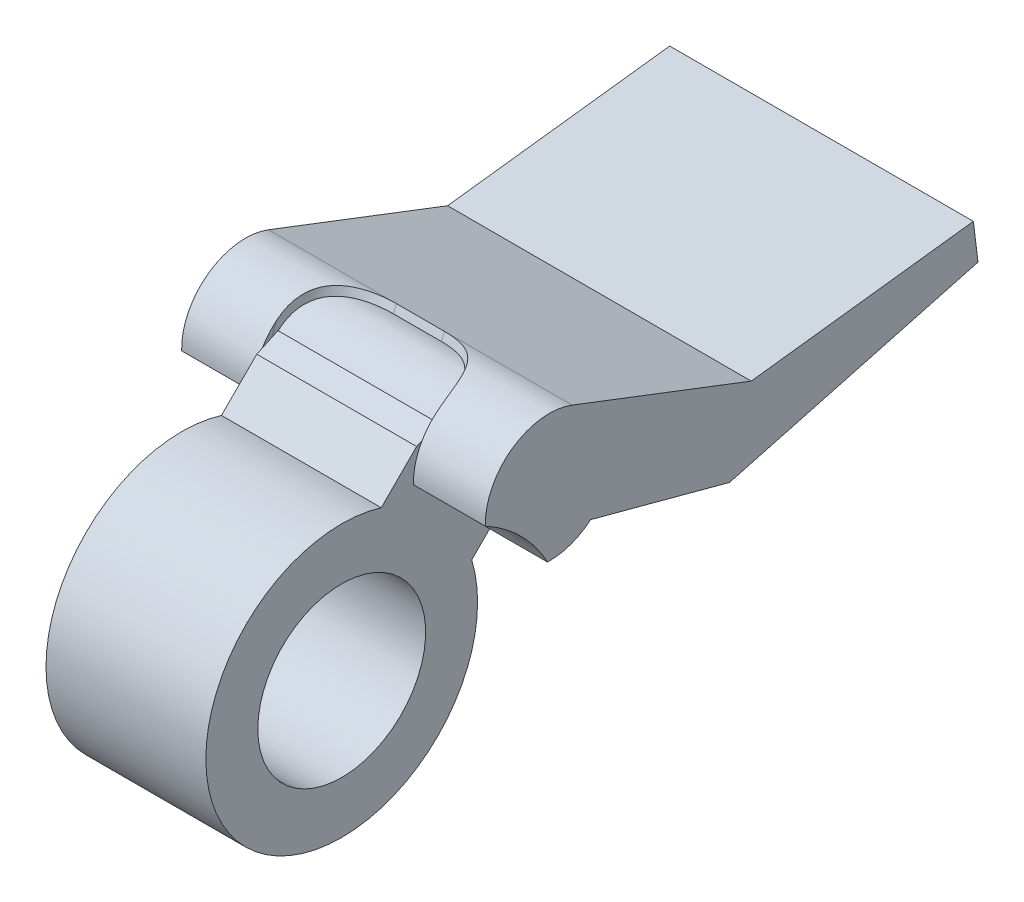
ISO-10303-21;
HEADER;
FILE_DESCRIPTION(('STEP AP214'),'2;1');
FILE_NAME('part.step','',(''),(''),'','','');
FILE_SCHEMA(('AUTOMOTIVE_DESIGN { 1 0 10303 214 1 1 1 1 }'));
ENDSEC;
DATA;
#1=APPLICATION_CONTEXT('core data for automotive mechanical design processes');
#2=APPLICATION_PROTOCOL_DEFINITION('international standard','automotive_design',2000,#1);
#3=PRODUCT_CONTEXT('',#1,'mechanical');
#4=PRODUCT('Part','Part','',(#3));
#5=PRODUCT_RELATED_PRODUCT_CATEGORY('part','',(#4));
#6=PRODUCT_DEFINITION_FORMATION('','',#4);
#7=PRODUCT_DEFINITION_CONTEXT('part definition',#1,'design');
#8=PRODUCT_DEFINITION('design','',#6,#7);
#9=PRODUCT_DEFINITION_SHAPE('','',#8);
#10=(LENGTH_UNIT() NAMED_UNIT(*) SI_UNIT(.MILLI.,.METRE.));
#11=(NAMED_UNIT(*) PLANE_ANGLE_UNIT() SI_UNIT($,.RADIAN.));
#12=(NAMED_UNIT(*) SI_UNIT($,.STERADIAN.) SOLID_ANGLE_UNIT());
#13=UNCERTAINTY_MEASURE_WITH_UNIT(LENGTH_MEASURE(1.E-05),#10,'distance_accuracy_value','');
#14=(GEOMETRIC_REPRESENTATION_CONTEXT(3) GLOBAL_UNCERTAINTY_ASSIGNED_CONTEXT((#13)) GLOBAL_UNIT_ASSIGNED_CONTEXT((#10,
#11,#12)) REPRESENTATION_CONTEXT('',''));
#15=CARTESIAN_POINT('',(0.,0.,0.));
#16=DIRECTION('',(0.,0.,1.));
#17=DIRECTION('',(1.,0.,0.));
#18=AXIS2_PLACEMENT_3D('',#15,#16,#17);
#19=CARTESIAN_POINT('',(10.,10.3423285417581,-4.68547429226573));
#20=DIRECTION('',(0.,-0.90630778703665,-0.4226182617407));
#21=DIRECTION('',(0.,0.4226182617407,-0.90630778703665));
#22=AXIS2_PLACEMENT_3D('',#19,#20,#21);
#23=PLANE('',#22);
#24=CARTESIAN_POINT('',(6.5,10.7760639855093,-5.61562295306029));
#25=DIRECTION('',(0.,-0.90630778703665,-0.4226182617407));
#26=DIRECTION('',(0.,0.4226182617407,-0.90630778703665));
#27=AXIS2_PLACEMENT_3D('',#24,#25,#26);
#28=ELLIPSE('',#27,5.03844788869005,3.5);
#29=CARTESIAN_POINT('',(9.98689528783067,10.9601551083915,-6.01040764008563));
#30=VERTEX_POINT('',#29);
#31=CARTESIAN_POINT('',(10.,10.7760639855093,-5.61562295306029));
#32=VERTEX_POINT('',#31);
#33=EDGE_CURVE('E181',#30,#32,#28,.T.);
#34=ORIENTED_EDGE('',*,*,#33,.F.);
#35=DIRECTION('',(-1.,0.,0.));
#36=VECTOR('',#35,1.);
#37=CARTESIAN_POINT('',(14.5265652051005,10.9601551083915,-6.01040764008563));
#38=LINE('',#37,#36);
#39=CARTESIAN_POINT('',(0.0131047121693319,10.9601551083915,-6.01040764008563));
#40=VERTEX_POINT('',#39);
#41=EDGE_CURVE('E179',#40,#30,#38,.F.);
#42=ORIENTED_EDGE('',*,*,#41,.F.);
#43=CARTESIAN_POINT('',(3.5,10.7760639855093,-5.61562295306029));
#44=DIRECTION('',(0.,-0.90630778703665,-0.4226182617407));
#45=DIRECTION('',(0.,0.4226182617407,-0.90630778703665));
#46=AXIS2_PLACEMENT_3D('',#43,#44,#45);
#47=ELLIPSE('',#46,5.03844788869005,3.5);
#48=CARTESIAN_POINT('',(0.,10.7760639855093,-5.61562295306029));
#49=VERTEX_POINT('',#48);
#50=EDGE_CURVE('E20',#49,#40,#47,.T.);
#51=ORIENTED_EDGE('',*,*,#50,.F.);
#52=DIRECTION('',(0.,0.4226182617407,-0.90630778703665));
#53=VECTOR('',#52,1.);
#54=CARTESIAN_POINT('',(0.,10.3423285417581,-4.68547429226573));
#55=LINE('',#54,#53);
#56=CARTESIAN_POINT('',(0.,10.5039197101017,-5.03200767107168));
#57=VERTEX_POINT('',#56);
#58=EDGE_CURVE('E157',#57,#49,#55,.T.);
#59=ORIENTED_EDGE('',*,*,#58,.F.);
#60=DIRECTION('',(0.,0.4226182617407,-0.90630778703665));
#61=VECTOR('',#60,1.);
#62=CARTESIAN_POINT('',(0.,10.3423285417581,-4.68547429226573));
#63=LINE('',#62,#61);
#64=CARTESIAN_POINT('',(0.,10.3423285417581,-4.68547429226573));
#65=VERTEX_POINT('',#64);
#66=EDGE_CURVE('E166',#65,#57,#63,.T.);
#67=ORIENTED_EDGE('',*,*,#66,.F.);
#68=DIRECTION('',(1.,0.,0.));
#69=VECTOR('',#68,1.);
#70=CARTESIAN_POINT('',(10.,10.3423285417581,-4.68547429226573));
#71=LINE('',#70,#69);
#72=CARTESIAN_POINT('',(10.,10.3423285417581,-4.68547429226573));
#73=VERTEX_POINT('',#72);
#74=EDGE_CURVE('E463',#73,#65,#71,.F.);
#75=ORIENTED_EDGE('',*,*,#74,.F.);
#76=DIRECTION('',(0.,0.4226182617407,-0.90630778703665));
#77=VECTOR('',#76,1.);
#78=CARTESIAN_POINT('',(10.,10.3423285417581,-4.68547429226573));
#79=LINE('',#78,#77);
#80=CARTESIAN_POINT('',(10.,10.5039197101017,-5.03200767107168));
#81=VERTEX_POINT('',#80);
#82=EDGE_CURVE('E471',#81,#73,#79,.F.);
#83=ORIENTED_EDGE('',*,*,#82,.F.);
#84=DIRECTION('',(0.,0.4226182617407,-0.90630778703665));
#85=VECTOR('',#84,1.);
#86=CARTESIAN_POINT('',(10.,10.3423285417581,-4.68547429226573));
#87=LINE('',#86,#85);
#88=EDGE_CURVE('E182',#32,#81,#87,.F.);
#89=ORIENTED_EDGE('',*,*,#88,.F.);
#90=EDGE_LOOP('',(#34,#42,#51,#59,#67,#75,#83,#89));
#91=FACE_BOUND('',#90,.T.);
#92=ADVANCED_FACE('F17',(#91),#23,.F.);
#93=CARTESIAN_POINT('',(14.5265652051005,8.48528137423859,-8.48528137423856));
#94=DIRECTION('',(-1.,0.,0.));
#95=DIRECTION('',(0.,0.,1.));
#96=AXIS2_PLACEMENT_3D('',#93,#94,#95);
#97=CYLINDRICAL_SURFACE('',#96,3.5);
#98=DIRECTION('',(1.,0.,0.));
#99=VECTOR('',#98,1.);
#100=CARTESIAN_POINT('',(14.5265652051005,11.7528128669788,-9.73956919764712));
#101=LINE('',#100,#99);
#102=CARTESIAN_POINT('',(3.5,11.7528128669788,-9.73956919764712));
#103=VERTEX_POINT('',#102);
#104=CARTESIAN_POINT('',(6.5,11.7528128669788,-9.73956919764712));
#105=VERTEX_POINT('',#104);
#106=EDGE_CURVE('E442',#103,#105,#101,.T.);
#107=ORIENTED_EDGE('',*,*,#106,.F.);
#108=CARTESIAN_POINT('',(3.5,11.7528128669788,-9.73956919764712));
#109=CARTESIAN_POINT('',(3.4025676074427,11.752781186248,-9.73956791054752));
#110=CARTESIAN_POINT('',(3.3051366374572,11.7542698399467,-9.73577101631505));
#111=CARTESIAN_POINT('',(3.11095369032644,11.760058994028,-9.7205764045936));
#112=CARTESIAN_POINT('',(3.01420170902847,11.7643594771981,-9.70917873363219));
#113=CARTESIAN_POINT('',(2.82188429503188,11.7755532156788,-9.67874647310753));
#114=CARTESIAN_POINT('',(2.72632122321626,11.7824509750819,-9.65969861304701));
#115=CARTESIAN_POINT('',(2.53722729784305,11.7983909539184,-9.61395101133336));
#116=CARTESIAN_POINT('',(2.44369641799689,11.8074331455933,-9.58725136872769));
#117=CARTESIAN_POINT('',(2.25924841442293,11.8270769458929,-9.52616130618465));
#118=CARTESIAN_POINT('',(2.16833381576069,11.8376800043558,-9.49176372025579));
#119=CARTESIAN_POINT('',(1.9898521164323,11.859695532696,-9.41528804404663));
#120=CARTESIAN_POINT('',(1.90228621198938,11.8711082877328,-9.3732072395915));
#121=CARTESIAN_POINT('',(1.73129902627252,11.8938458808696,-9.2814710731802));
#122=CARTESIAN_POINT('',(1.64787408663297,11.9051707888358,-9.23182256074788));
#123=CARTESIAN_POINT('',(1.48579372439595,11.9267392960008,-9.12507086086172));
#124=CARTESIAN_POINT('',(1.40713759152401,11.9369830563969,-9.06796878756865));
#125=CARTESIAN_POINT('',(1.25822406218825,11.9549369312418,-8.94893030001388));
#126=CARTESIAN_POINT('',(1.18775961389857,11.9627296229293,-8.88726579019605));
#127=CARTESIAN_POINT('',(1.05252700247004,11.9752655578555,-8.75774881690683));
#128=CARTESIAN_POINT('',(0.987755758036894,11.9800104595106,-8.68989974168003));
#129=CARTESIAN_POINT('',(0.864486938755875,11.9854194725079,-8.54867997186559));
#130=CARTESIAN_POINT('',(0.805983197417952,11.9860876317962,-8.47531482770426));
#131=CARTESIAN_POINT('',(0.695629294468147,11.9823767365089,-8.32386261084754));
#132=CARTESIAN_POINT('',(0.64377797277605,11.9779985632696,-8.24577636494385));
#133=CARTESIAN_POINT('',(0.553593276450099,11.9643514641508,-8.09685248391291));
#134=CARTESIAN_POINT('',(0.514380640771426,11.9558300610736,-8.02647654928564));
#135=CARTESIAN_POINT('',(0.441155804331323,11.9339659507001,-7.88379800741679));
#136=CARTESIAN_POINT('',(0.407143223427473,11.9206235960724,-7.81149554146567));
#137=CARTESIAN_POINT('',(0.344224570915974,11.8888118213275,-7.66580881720184));
#138=CARTESIAN_POINT('',(0.315318212463551,11.8703426893597,-7.59242461990705));
#139=CARTESIAN_POINT('',(0.262379666762911,11.8281232747902,-7.44544096644063));
#140=CARTESIAN_POINT('',(0.238347444502004,11.8043730301272,-7.37184151181913));
#141=CARTESIAN_POINT('',(0.175592723579635,11.7281746360687,-7.16048197476904));
#142=CARTESIAN_POINT('',(0.142613980091129,11.6688933627925,-7.02339965149114));
#143=CARTESIAN_POINT('',(0.089624938615377,11.5320063678796,-6.7560972639787));
#144=CARTESIAN_POINT('',(0.0696216633976598,11.4543907540153,-6.62588095083187));
#145=CARTESIAN_POINT('',(0.0435871694539562,11.3080885333855,-6.41330298540576));
#146=CARTESIAN_POINT('',(0.0351677118626656,11.2436508120867,-6.32825805976484));
#147=CARTESIAN_POINT('',(0.0218225509425708,11.1073441587283,-6.16447608509379));
#148=CARTESIAN_POINT('',(0.0168865304938026,11.0354978996574,-6.08572102667538));
#149=CARTESIAN_POINT('',(0.0131047121693309,10.9601551083915,-6.01040764008563));
#150=B_SPLINE_CURVE_WITH_KNOTS('',3,(#108,#109,#110,#111,#112,#113,#114,#115,#116,#117,#118,
#119,#120,#121,#122,#123,#124,#125,#126,#127,#128,#129,#130,#131,#132,#133,#134,#135,#136,#137,
#138,#139,#140,#141,#142,#143,#144,#145,#146,#147,#148,#149),.UNSPECIFIED.,.F.,.F.,(4,2,2,2,2,2,
2,2,2,2,2,2,2,2,2,2,2,2,2,2,4),(0.,0.29220984509211,0.584417901460318,0.87713504472713,
1.16984839912799,1.46283538137322,1.75592606520031,2.04875303113694,2.34153627522083,
2.62301114727313,2.90433272828975,3.18537492933528,3.46636805411258,3.70908135858463,
3.95177691136182,4.19445882624814,4.43713899780042,4.89390982158901,5.35092765963071,
5.67154438835239,5.99120749472194),.UNSPECIFIED.);
#151=EDGE_CURVE('E175',#103,#40,#150,.T.);
#152=ORIENTED_EDGE('',*,*,#151,.T.);
#153=ORIENTED_EDGE('',*,*,#41,.T.);
#154=CARTESIAN_POINT('',(9.98689528783067,10.9601551083915,-6.01040764008563));
#155=CARTESIAN_POINT('',(9.98383068440402,11.0213605694413,-6.07159707492825));
#156=CARTESIAN_POINT('',(9.97999470231724,11.0802700482353,-6.1350618223779));
#157=CARTESIAN_POINT('',(9.97017866934813,11.1931866568324,-6.26611194449141));
#158=CARTESIAN_POINT('',(9.96419749819988,11.2471912066695,-6.33369945682168));
#159=CARTESIAN_POINT('',(9.94945786152549,11.350159422206,-6.47281978255372));
#160=CARTESIAN_POINT('',(9.94068673119811,11.3990987249413,-6.54436933348673));
#161=CARTESIAN_POINT('',(9.91972201686225,11.4913310038454,-6.69053083166246));
#162=CARTESIAN_POINT('',(9.90752901974698,11.5346249464013,-6.76514225188417));
#163=CARTESIAN_POINT('',(9.87899470100175,11.6155059374659,-6.91711731364479));
#164=CARTESIAN_POINT('',(9.8626336009626,11.6530643714767,-6.99449252113921));
#165=CARTESIAN_POINT('',(9.82516013054991,11.722024632355,-7.15081918629097));
#166=CARTESIAN_POINT('',(9.80404828369698,11.753427136878,-7.22977046939572));
#167=CARTESIAN_POINT('',(9.75658913105542,11.8099136475857,-7.38807516177691));
#168=CARTESIAN_POINT('',(9.73025778296333,11.8350163967299,-7.4674266440887));
#169=CARTESIAN_POINT('',(9.67189528394595,11.8790885242996,-7.62573391847131));
#170=CARTESIAN_POINT('',(9.6398648025192,11.898058622414,-7.70468975590108));
#171=CARTESIAN_POINT('',(9.57291387195755,11.928702622049,-7.85428152474733));
#172=CARTESIAN_POINT('',(9.53849235746645,11.9408700887127,-7.92504040524205));
#173=CARTESIAN_POINT('',(9.46461122957368,11.9606186447102,-8.06457127803642));
#174=CARTESIAN_POINT('',(9.42514996267347,11.968198224093,-8.13334260911661));
#175=CARTESIAN_POINT('',(9.34124386846137,11.9791954596533,-8.26815941958469));
#176=CARTESIAN_POINT('',(9.2967969101396,11.9826113286971,-8.33420371674263));
#177=CARTESIAN_POINT('',(9.20309185115628,11.9858022557293,-8.46291255344453));
#178=CARTESIAN_POINT('',(9.15383187873182,11.9855758916205,-8.52557576327321));
#179=CARTESIAN_POINT('',(9.05283845110968,11.9821424286352,-8.64453569151437));
#180=CARTESIAN_POINT('',(9.00128240174624,11.9790547578954,-8.70098673449934));
#181=CARTESIAN_POINT('',(8.89427831973041,11.9706230431939,-8.8099028451772));
#182=CARTESIAN_POINT('',(8.83882894349844,11.9652782170697,-8.86236652370227));
#183=CARTESIAN_POINT('',(8.66715001920746,11.9467074742887,-9.01330047632269));
#184=CARTESIAN_POINT('',(8.54550961543979,11.9309408125183,-9.10540782088599));
#185=CARTESIAN_POINT('',(8.27704609568525,11.8951346476117,-9.28008786354764));
#186=CARTESIAN_POINT('',(8.12892120828669,11.8748183408258,-9.36058183207881));
#187=CARTESIAN_POINT('',(7.82194167564154,11.8361540154781,-9.4985990221215));
#188=CARTESIAN_POINT('',(7.66307979276908,11.8178073466204,-9.55610656463763));
#189=CARTESIAN_POINT('',(7.41971557089616,11.794602774581,-9.62499863321719));
#190=CARTESIAN_POINT('',(7.33776800759377,11.7875882529461,-9.64506520991352));
#191=CARTESIAN_POINT('',(7.17252912686501,11.7753087215501,-9.6794579149125));
#192=CARTESIAN_POINT('',(7.0892377951382,11.7700437304205,-9.69378398208246));
#193=CARTESIAN_POINT('',(6.92184384478311,11.7615287875045,-9.71668671408093));
#194=CARTESIAN_POINT('',(6.83774198068241,11.758277116731,-9.72526828411101));
#195=CARTESIAN_POINT('',(6.66909433379317,11.7539103662413,-9.73670888978394));
#196=CARTESIAN_POINT('',(6.58454854853287,11.7527952984344,-9.73956789352934));
#197=CARTESIAN_POINT('',(6.5,11.7528128669788,-9.73956919764712));
#198=B_SPLINE_CURVE_WITH_KNOTS('',3,(#154,#155,#156,#157,#158,#159,#160,#161,#162,#163,#164,
#165,#166,#167,#168,#169,#170,#171,#172,#173,#174,#175,#176,#177,#178,#179,#180,#181,#182,#183,
#184,#185,#186,#187,#188,#189,#190,#191,#192,#193,#194,#195,#196,#197),.UNSPECIFIED.,.F.,.F.,(4,
2,2,2,2,2,2,2,2,2,2,2,2,2,2,2,2,2,2,2,2,4),(0.,0.259757465111959,0.519650779395175,
0.780741112188048,1.04178669204138,1.3040948352294,1.56637408684841,1.82786350182374,
2.0893222189139,2.32787779067232,2.56651183245983,2.80524826391723,3.04407791143266,
3.27336738928545,3.50273638713344,3.96110733578087,4.46858641303622,4.97641105246869,
5.23020877630565,5.48400920285118,5.73759263290052,5.99117747641356),.UNSPECIFIED.);
#199=EDGE_CURVE('E255',#30,#105,#198,.T.);
#200=ORIENTED_EDGE('',*,*,#199,.T.);
#201=EDGE_LOOP('',(#107,#152,#153,#200));
#202=FACE_BOUND('',#201,.T.);
#203=ADVANCED_FACE('F196',(#202),#97,.T.);
#204=CARTESIAN_POINT('',(10.,0.,0.));
#205=DIRECTION('',(-1.,0.,0.));
#206=DIRECTION('',(0.,0.,1.));
#207=AXIS2_PLACEMENT_3D('',#204,#205,#206);
#208=CYLINDRICAL_SURFACE('',#207,5.25);
#209=CARTESIAN_POINT('',(10.,0.,0.));
#210=DIRECTION('',(-1.,0.,0.));
#211=DIRECTION('',(0.,0.,1.));
#212=AXIS2_PLACEMENT_3D('',#209,#210,#211);
#213=CIRCLE('',#212,5.25);
#214=CARTESIAN_POINT('',(10.,0.,5.25));
#215=VERTEX_POINT('',#214);
#216=EDGE_CURVE('E263',#215,#215,#213,.T.);
#217=ORIENTED_EDGE('',*,*,#216,.F.);
#218=EDGE_LOOP('',(#217));
#219=FACE_BOUND('',#218,.T.);
#220=CARTESIAN_POINT('',(0.,0.,0.));
#221=DIRECTION('',(-1.,0.,0.));
#222=DIRECTION('',(0.,0.,1.));
#223=AXIS2_PLACEMENT_3D('',#220,#221,#222);
#224=CIRCLE('',#223,5.25);
#225=CARTESIAN_POINT('',(0.,0.,5.25));
#226=VERTEX_POINT('',#225);
#227=EDGE_CURVE('E194',#226,#226,#224,.T.);
#228=ORIENTED_EDGE('',*,*,#227,.T.);
#229=EDGE_LOOP('',(#228));
#230=FACE_BOUND('',#229,.T.);
#231=ADVANCED_FACE('F275',(#219,#230),#208,.F.);
#232=CARTESIAN_POINT('',(10.,2.82842712474618,2.82842712474619));
#233=DIRECTION('',(0.,0.707106781186546,0.707106781186549));
#234=DIRECTION('',(0.,-0.707106781186549,0.707106781186546));
#235=AXIS2_PLACEMENT_3D('',#232,#233,#234);
#236=PLANE('',#235);
#237=DIRECTION('',(0.,-0.707106781186549,0.707106781186546));
#238=VECTOR('',#237,1.);
#239=CARTESIAN_POINT('',(0.,10.3423285417581,-4.68547429226573));
#240=LINE('',#239,#238);
#241=CARTESIAN_POINT('',(0.,8.1317279836453,-2.4748737341529));
#242=VERTEX_POINT('',#241);
#243=EDGE_CURVE('E270',#65,#242,#240,.T.);
#244=ORIENTED_EDGE('',*,*,#243,.T.);
#245=DIRECTION('',(-1.,0.,0.));
#246=VECTOR('',#245,1.);
#247=CARTESIAN_POINT('',(10.,8.1317279836453,-2.4748737341529));
#248=LINE('',#247,#246);
#249=CARTESIAN_POINT('',(10.,8.1317279836453,-2.4748737341529));
#250=VERTEX_POINT('',#249);
#251=EDGE_CURVE('E176',#250,#242,#248,.T.);
#252=ORIENTED_EDGE('',*,*,#251,.F.);
#253=DIRECTION('',(0.,-0.707106781186549,0.707106781186546));
#254=VECTOR('',#253,1.);
#255=CARTESIAN_POINT('',(10.,10.3423285417581,-4.68547429226573));
#256=LINE('',#255,#254);
#257=EDGE_CURVE('E431',#73,#250,#256,.T.);
#258=ORIENTED_EDGE('',*,*,#257,.F.);
#259=ORIENTED_EDGE('',*,*,#74,.T.);
#260=EDGE_LOOP('',(#244,#252,#258,#259));
#261=FACE_BOUND('',#260,.T.);
#262=ADVANCED_FACE('F531',(#261),#236,.T.);
#263=CARTESIAN_POINT('',(10.,0.,0.));
#264=DIRECTION('',(-1.,0.,0.));
#265=DIRECTION('',(0.,0.,1.));
#266=AXIS2_PLACEMENT_3D('',#263,#264,#265);
#267=CYLINDRICAL_SURFACE('',#266,8.5);
#268=CARTESIAN_POINT('',(0.,0.,0.));
#269=DIRECTION('',(-1.,0.,0.));
#270=DIRECTION('',(0.,0.,1.));
#271=AXIS2_PLACEMENT_3D('',#268,#269,#270);
#272=CIRCLE('',#271,8.5);
#273=CARTESIAN_POINT('',(0.,2.47487373415293,-8.13172798364529));
#274=VERTEX_POINT('',#273);
#275=EDGE_CURVE('E265',#242,#274,#272,.F.);
#276=ORIENTED_EDGE('',*,*,#275,.T.);
#277=DIRECTION('',(1.,0.,0.));
#278=VECTOR('',#277,1.);
#279=CARTESIAN_POINT('',(10.,2.47487373415293,-8.13172798364529));
#280=LINE('',#279,#278);
#281=CARTESIAN_POINT('',(10.,2.47487373415293,-8.13172798364529));
#282=VERTEX_POINT('',#281);
#283=EDGE_CURVE('E427',#274,#282,#280,.T.);
#284=ORIENTED_EDGE('',*,*,#283,.T.);
#285=CARTESIAN_POINT('',(10.,0.,0.));
#286=DIRECTION('',(-1.,0.,0.));
#287=DIRECTION('',(0.,0.,1.));
#288=AXIS2_PLACEMENT_3D('',#285,#286,#287);
#289=CIRCLE('',#288,8.5);
#290=EDGE_CURVE('E428',#250,#282,#289,.F.);
#291=ORIENTED_EDGE('',*,*,#290,.F.);
#292=ORIENTED_EDGE('',*,*,#251,.T.);
#293=EDGE_LOOP('',(#276,#284,#291,#292));
#294=FACE_BOUND('',#293,.T.);
#295=ADVANCED_FACE('F529',(#294),#267,.T.);
#296=CARTESIAN_POINT('',(0.,0.,0.));
#297=DIRECTION('',(-1.,0.,0.));
#298=DIRECTION('',(0.,0.,1.));
#299=AXIS2_PLACEMENT_3D('',#296,#297,#298);
#300=PLANE('',#299);
#301=DIRECTION('',(0.,0.933580426497202,-0.3583679495453));
#302=VECTOR('',#301,1.);
#303=CARTESIAN_POINT('',(0.,-0.494848697999604,-1.28912493183673));
#304=LINE('',#303,#302);
#305=CARTESIAN_POINT('',(0.,11.5474399197316,-5.91172643170009));
#306=VERTEX_POINT('',#305);
#307=EDGE_CURVE('E160',#49,#306,#304,.T.);
#308=ORIENTED_EDGE('',*,*,#307,.T.);
#309=CARTESIAN_POINT('',(0.,8.48528137423859,-8.48528137423856));
#310=DIRECTION('',(-1.,0.,0.));
#311=DIRECTION('',(0.,0.,1.));
#312=AXIS2_PLACEMENT_3D('',#309,#310,#311);
#313=CIRCLE('',#312,4.);
#314=EDGE_CURVE('E163',#57,#306,#313,.T.);
#315=ORIENTED_EDGE('',*,*,#314,.F.);
#316=ORIENTED_EDGE('',*,*,#58,.T.);
#317=EDGE_LOOP('',(#308,#315,#316));
#318=FACE_BOUND('',#317,.T.);
#319=ADVANCED_FACE('F159',(#318),#300,.F.);
#320=CARTESIAN_POINT('',(3.5,-0.494848697999602,-1.28912493183673));
#321=DIRECTION('',(0.,0.933580426497202,-0.3583679495453));
#322=DIRECTION('',(0.,0.3583679495453,0.933580426497202));
#323=AXIS2_PLACEMENT_3D('',#320,#321,#322);
#324=CYLINDRICAL_SURFACE('',#323,3.5);
#325=DIRECTION('',(0.,-0.933580426497202,0.3583679495453));
#326=VECTOR('',#325,1.);
#327=CARTESIAN_POINT('',(3.5,-1.74913652140815,-4.55665642457694));
#328=LINE('',#327,#326);
#329=CARTESIAN_POINT('',(3.5,12.2196030802274,-9.91875317241977));
#330=VERTEX_POINT('',#329);
#331=EDGE_CURVE('E262',#330,#103,#328,.T.);
#332=ORIENTED_EDGE('',*,*,#331,.F.);
#333=CARTESIAN_POINT('',(0.,11.5474399197316,-5.91172643170009));
#334=CARTESIAN_POINT('',(8.251029840609E-06,11.6091040140227,-5.9850798451474));
#335=CARTESIAN_POINT('',(0.000922393732501889,11.6681272472937,-6.06067883573111));
#336=CARTESIAN_POINT('',(0.0053487739008257,11.7806066813607,-6.21591990250146));
#337=CARTESIAN_POINT('',(0.00886293177730926,11.8340587338869,-6.29556492663201));
#338=CARTESIAN_POINT('',(0.0193113459060637,11.9353419268384,-6.45886173842109));
#339=CARTESIAN_POINT('',(0.0262673811808041,11.9831348398865,-6.54253593748594));
#340=CARTESIAN_POINT('',(0.0444447798141675,12.072385384336,-6.71273710912541));
#341=CARTESIAN_POINT('',(0.055665153370668,12.1138444827604,-6.79926341543987));
#342=CARTESIAN_POINT('',(0.0832813655428178,12.1904323274981,-6.97495166655823));
#343=CARTESIAN_POINT('',(0.0997095754746625,12.2255192594507,-7.06412684635223));
#344=CARTESIAN_POINT('',(0.138496865861652,12.2888701652437,-7.24360299709195));
#345=CARTESIAN_POINT('',(0.160855086554264,12.3171351270334,-7.33390380303152));
#346=CARTESIAN_POINT('',(0.212066375527736,12.3667324980052,-7.51417737608244));
#347=CARTESIAN_POINT('',(0.240894179931607,12.388091105338,-7.60415007165345));
#348=CARTESIAN_POINT('',(0.305570354015494,12.4241840361118,-7.7828891539569));
#349=CARTESIAN_POINT('',(0.341417550691078,12.4389194649924,-7.87165573959454));
#350=CARTESIAN_POINT('',(0.415593760377383,12.4607401552406,-8.03611077517424));
#351=CARTESIAN_POINT('',(0.453095002245694,12.4685363076177,-8.11208006166646));
#352=CARTESIAN_POINT('',(0.533732364827054,12.4797062882383,-8.26130243389718));
#353=CARTESIAN_POINT('',(0.576868165440588,12.4830803675798,-8.33455567363114));
#354=CARTESIAN_POINT('',(0.668702976961731,12.4859152226501,-8.47766540320183));
#355=CARTESIAN_POINT('',(0.717407461066556,12.4853721152505,-8.54751845335486));
#356=CARTESIAN_POINT('',(0.820107898490632,12.4809625900382,-8.68310354888191));
#357=CARTESIAN_POINT('',(0.874103889637379,12.4770961484665,-8.74883556479032));
#358=CARTESIAN_POINT('',(0.984203475677153,12.4669586487592,-8.87244581055493));
#359=CARTESIAN_POINT('',(1.04006243920791,12.4608190667354,-8.93055310260192));
#360=CARTESIAN_POINT('',(1.15592717559222,12.4467151957569,-9.04224873291991));
#361=CARTESIAN_POINT('',(1.21593435301411,12.4387502866195,-9.0958355267974));
#362=CARTESIAN_POINT('',(1.40159848458845,12.4129972172442,-9.24936136170283));
#363=CARTESIAN_POINT('',(1.53299228659643,12.3933401321552,-9.3421713391182));
#364=CARTESIAN_POINT('',(1.82067326624042,12.3515642563453,-9.51510344067821));
#365=CARTESIAN_POINT('',(1.97813922469576,12.3293868931287,-9.59323408956064));
#366=CARTESIAN_POINT('',(2.30362713753442,12.2890517778462,-9.72466627483553));
#367=CARTESIAN_POINT('',(2.4716516878125,12.2708950192736,-9.7779616780122));
#368=CARTESIAN_POINT('',(2.78297403091046,12.2446675753266,-9.85212113478838));
#369=CARTESIAN_POINT('',(2.92519218139919,12.2353612927878,-9.8771274227842));
#370=CARTESIAN_POINT('',(3.14001435068339,12.2259583180014,-9.9021109803285));
#371=CARTESIAN_POINT('',(3.21183818540426,12.2235834466558,-9.90835119226666));
#372=CARTESIAN_POINT('',(3.35576941062657,12.2204026912982,-9.91667172240712));
#373=CARTESIAN_POINT('',(3.42787683311227,12.2195969896633,-9.91875155706943));
#374=CARTESIAN_POINT('',(3.5,12.2196030802274,-9.91875317241977));
#375=B_SPLINE_CURVE_WITH_KNOTS('',3,(#333,#334,#335,#336,#337,#338,#339,#340,#341,#342,#343,
#344,#345,#346,#347,#348,#349,#350,#351,#352,#353,#354,#355,#356,#357,#358,#359,#360,#361,#362,
#363,#364,#365,#366,#367,#368,#369,#370,#371,#372,#373,#374),.UNSPECIFIED.,.F.,.F.,(4,2,2,2,2,2,
2,2,2,2,2,2,2,2,2,2,2,2,2,2,4),(0.,0.287450780147852,0.575114088044376,0.8646213673456,
1.15406148966617,1.4453372303755,1.73657076353861,2.02668622305999,2.31675324295392,
2.57165376125026,2.82653980493043,3.08167855322424,3.33681912556627,3.5790584342759,
3.82138016981986,4.30560273554127,4.83500000532893,5.36452794381422,5.79747481675415,
6.01375335753659,6.23005703383996),.UNSPECIFIED.);
#376=EDGE_CURVE('E174',#306,#330,#375,.T.);
#377=ORIENTED_EDGE('',*,*,#376,.F.);
#378=ORIENTED_EDGE('',*,*,#307,.F.);
#379=ORIENTED_EDGE('',*,*,#50,.T.);
#380=ORIENTED_EDGE('',*,*,#151,.F.);
#381=EDGE_LOOP('',(#332,#377,#378,#379,#380));
#382=FACE_BOUND('',#381,.T.);
#383=ADVANCED_FACE('F170',(#382),#324,.F.);
#384=CARTESIAN_POINT('',(0.,0.,0.));
#385=DIRECTION('',(1.,0.,0.));
#386=DIRECTION('',(0.,0.,-1.));
#387=AXIS2_PLACEMENT_3D('',#384,#385,#386);
#388=PLANE('',#387);
#389=ORIENTED_EDGE('',*,*,#66,.T.);
#390=CARTESIAN_POINT('',(0.,8.48528137423859,-8.48528137423856));
#391=DIRECTION('',(-1.,0.,0.));
#392=DIRECTION('',(0.,0.,1.));
#393=AXIS2_PLACEMENT_3D('',#390,#391,#392);
#394=CIRCLE('',#393,4.);
#395=CARTESIAN_POINT('',(0.,8.37366564650718,-4.48683893632314));
#396=VERTEX_POINT('',#395);
#397=EDGE_CURVE('E519',#396,#57,#394,.T.);
#398=ORIENTED_EDGE('',*,*,#397,.F.);
#399=CARTESIAN_POINT('',(0.,0.,0.));
#400=DIRECTION('',(1.,0.,0.));
#401=DIRECTION('',(0.,0.,-1.));
#402=AXIS2_PLACEMENT_3D('',#399,#400,#401);
#403=CIRCLE('',#402,9.5);
#404=CARTESIAN_POINT('',(0.,4.48683893632317,-8.37366564650717));
#405=VERTEX_POINT('',#404);
#406=EDGE_CURVE('E423',#396,#405,#403,.F.);
#407=ORIENTED_EDGE('',*,*,#406,.T.);
#408=CARTESIAN_POINT('',(0.,8.48528137423859,-8.48528137423856));
#409=DIRECTION('',(1.,0.,0.));
#410=DIRECTION('',(0.,0.,-1.));
#411=AXIS2_PLACEMENT_3D('',#408,#409,#410);
#412=CIRCLE('',#411,4.);
#413=CARTESIAN_POINT('',(0.,5.43559950443602,-11.0736091148845));
#414=VERTEX_POINT('',#413);
#415=EDGE_CURVE('E215',#414,#405,#412,.F.);
#416=ORIENTED_EDGE('',*,*,#415,.F.);
#417=DIRECTION('',(0.,0.258819045102386,0.965925826289104));
#418=VECTOR('',#417,1.);
#419=CARTESIAN_POINT('',(0.,5.43161716362648,-11.0884714131188));
#420=LINE('',#419,#418);
#421=CARTESIAN_POINT('',(0.,5.43161716362648,-11.0884714131188));
#422=VERTEX_POINT('',#421);
#423=EDGE_CURVE('E266',#422,#414,#420,.T.);
#424=ORIENTED_EDGE('',*,*,#423,.F.);
#425=DIRECTION('',(0.,-0.707106781186549,0.707106781186546));
#426=VECTOR('',#425,1.);
#427=CARTESIAN_POINT('',(0.,-2.82842712474618,-2.82842712474619));
#428=LINE('',#427,#426);
#429=EDGE_CURVE('E424',#422,#274,#428,.T.);
#430=ORIENTED_EDGE('',*,*,#429,.T.);
#431=ORIENTED_EDGE('',*,*,#275,.F.);
#432=ORIENTED_EDGE('',*,*,#243,.F.);
#433=EDGE_LOOP('',(#389,#398,#407,#416,#424,#430,#431,#432));
#434=FACE_BOUND('',#433,.T.);
#435=ORIENTED_EDGE('',*,*,#227,.F.);
#436=EDGE_LOOP('',(#435));
#437=FACE_BOUND('',#436,.T.);
#438=ADVANCED_FACE('F203',(#434,#437),#388,.F.);
#439=CARTESIAN_POINT('',(14.5265652051005,-1.74913652140815,-4.55665642457694));
#440=DIRECTION('',(0.,0.3583679495453,0.933580426497202));
#441=DIRECTION('',(0.,-0.933580426497202,0.3583679495453));
#442=AXIS2_PLACEMENT_3D('',#439,#440,#441);
#443=PLANE('',#442);
#444=DIRECTION('',(1.,0.,0.));
#445=VECTOR('',#444,1.);
#446=CARTESIAN_POINT('',(10.,12.2196030802274,-9.91875317241977));
#447=LINE('',#446,#445);
#448=CARTESIAN_POINT('',(6.5,12.2196030802274,-9.91875317241977));
#449=VERTEX_POINT('',#448);
#450=EDGE_CURVE('E338',#330,#449,#447,.T.);
#451=ORIENTED_EDGE('',*,*,#450,.F.);
#452=ORIENTED_EDGE('',*,*,#331,.T.);
#453=ORIENTED_EDGE('',*,*,#106,.T.);
#454=DIRECTION('',(0.,0.933580426497202,-0.3583679495453));
#455=VECTOR('',#454,1.);
#456=CARTESIAN_POINT('',(6.5,-1.74913652140815,-4.55665642457694));
#457=LINE('',#456,#455);
#458=EDGE_CURVE('E261',#105,#449,#457,.T.);
#459=ORIENTED_EDGE('',*,*,#458,.T.);
#460=EDGE_LOOP('',(#451,#452,#453,#459));
#461=FACE_BOUND('',#460,.T.);
#462=ADVANCED_FACE('F245',(#461),#443,.T.);
#463=CARTESIAN_POINT('',(6.5,-0.494848697999602,-1.28912493183673));
#464=DIRECTION('',(0.,0.933580426497202,-0.3583679495453));
#465=DIRECTION('',(0.,0.3583679495453,0.933580426497202));
#466=AXIS2_PLACEMENT_3D('',#463,#464,#465);
#467=CYLINDRICAL_SURFACE('',#466,3.5);
#468=DIRECTION('',(0.,0.933580426497203,-0.358367949545298));
#469=VECTOR('',#468,1.);
#470=CARTESIAN_POINT('',(10.,10.7760639855093,-5.61562295306029));
#471=LINE('',#470,#469);
#472=CARTESIAN_POINT('',(10.,11.5474399197316,-5.91172643170008));
#473=VERTEX_POINT('',#472);
#474=EDGE_CURVE('E436',#32,#473,#471,.T.);
#475=ORIENTED_EDGE('',*,*,#474,.T.);
#476=CARTESIAN_POINT('',(6.5,12.2196030802274,-9.91875317241977));
#477=CARTESIAN_POINT('',(6.59766826280478,12.219574632539,-9.91875323388375));
#478=CARTESIAN_POINT('',(6.69533508208795,12.2210672220542,-9.91493662388911));
#479=CARTESIAN_POINT('',(6.8899838782369,12.2268889895003,-9.89967025519961));
#480=CARTESIAN_POINT('',(6.98696586579832,12.2312181230306,-9.88822061598452));
#481=CARTESIAN_POINT('',(7.17967762122424,12.2425140388361,-9.85767071086388));
#482=CARTESIAN_POINT('',(7.27540580954555,12.2494838686773,-9.83856160386279));
#483=CARTESIAN_POINT('',(7.46481914803073,12.2656596948537,-9.79269660401369));
#484=CARTESIAN_POINT('',(7.5585043240667,12.2748656628533,-9.76594080806167));
#485=CARTESIAN_POINT('',(7.74323086707024,12.2949892460459,-9.70477366749959));
#486=CARTESIAN_POINT('',(7.83427026209747,12.3059081009705,-9.67035677041723));
#487=CARTESIAN_POINT('',(8.01300864770704,12.3287908814356,-9.59389640788074));
#488=CARTESIAN_POINT('',(8.10070600588265,12.34075530852,-9.55184927180032));
#489=CARTESIAN_POINT('',(8.27199016357282,12.3649311985501,-9.4602473219569));
#490=CARTESIAN_POINT('',(8.35557938527753,12.3771425097876,-9.41069700421209));
#491=CARTESIAN_POINT('',(8.51798129766937,12.400923515424,-9.30425463110765));
#492=CARTESIAN_POINT('',(8.59679675929854,12.4124935816973,-9.24736689596915));
#493=CARTESIAN_POINT('',(8.74675234019373,12.4337068807545,-9.12830584033827));
#494=CARTESIAN_POINT('',(8.81805154411968,12.4433974045136,-9.06634157473831));
#495=CARTESIAN_POINT('',(8.9549477891794,12.4603310799391,-8.93615208819761));
#496=CARTESIAN_POINT('',(9.02054762639798,12.4675754367776,-8.86792997149143));
#497=CARTESIAN_POINT('',(9.14550206617603,12.4786787839419,-8.72580654452016));
#498=CARTESIAN_POINT('',(9.20486088511188,12.4825400729399,-8.65190912760591));
#499=CARTESIAN_POINT('',(9.31693933437563,12.4859862662358,-8.49914851081455));
#500=CARTESIAN_POINT('',(9.36965982516522,12.4855717253466,-8.42028595651162));
#501=CARTESIAN_POINT('',(9.46276801773515,12.4799936728766,-8.26741448263806));
#502=CARTESIAN_POINT('',(9.50387420729312,12.4753562637016,-8.19382254867521));
#503=CARTESIAN_POINT('',(9.5805283720695,12.4615979081166,-8.04420508684437));
#504=CARTESIAN_POINT('',(9.61607663280958,12.4524771921227,-7.9681796842303));
#505=CARTESIAN_POINT('',(9.68166848269445,12.4294070526856,-7.81453114493699));
#506=CARTESIAN_POINT('',(9.71171345668167,12.4154588465878,-7.73690841569159));
#507=CARTESIAN_POINT('',(9.76651111222474,12.3825124048665,-7.58087602712115));
#508=CARTESIAN_POINT('',(9.79126379333012,12.3635141688132,-7.50246636772912));
#509=CARTESIAN_POINT('',(9.83483849770406,12.3212992218923,-7.34905187526702));
#510=CARTESIAN_POINT('',(9.85387077161138,12.2983005765399,-7.27404649921222));
#511=CARTESIAN_POINT('',(9.88776772083413,12.2475939820258,-7.12467877819859));
#512=CARTESIAN_POINT('',(9.90263082621018,12.2198842651573,-7.05031668566214));
#513=CARTESIAN_POINT('',(9.94161175639067,12.1297318547683,-6.82899329565916));
#514=CARTESIAN_POINT('',(9.96011653655167,12.0602706097363,-6.68381221054357));
#515=CARTESIAN_POINT('',(9.98329504853309,11.9200129410136,-6.43125099450955));
#516=CARTESIAN_POINT('',(9.99002816940295,11.8524174069188,-6.32222878934504));
#517=CARTESIAN_POINT('',(9.99835670608863,11.7072442446964,-6.1113993573712));
#518=CARTESIAN_POINT('',(9.99997044700889,11.6297032566662,-6.00956767493212));
#519=CARTESIAN_POINT('',(10.,11.5474399197316,-5.91172643170008));
#520=B_SPLINE_CURVE_WITH_KNOTS('',3,(#476,#477,#478,#479,#480,#481,#482,#483,#484,#485,#486,
#487,#488,#489,#490,#491,#492,#493,#494,#495,#496,#497,#498,#499,#500,#501,#502,#503,#504,#505,
#506,#507,#508,#509,#510,#511,#512,#513,#514,#515,#516,#517,#518,#519),.UNSPECIFIED.,.F.,.F.,(4,
2,2,2,2,2,2,2,2,2,2,2,2,2,2,2,2,2,2,2,2,4),(0.,0.292916807240948,0.58582902956387,
0.879080329881088,1.17232791439223,1.46578872953957,1.75939109390858,2.05281821850865,
2.34607335724181,2.6305548450872,2.91489597001847,3.19904374528544,3.48315465125157,
3.73608968591567,3.98901172254084,4.24187002637862,4.49472835173898,4.7366471429461,
4.97865690901659,5.46273150620569,5.84743988013199,6.23076960612796),.UNSPECIFIED.);
#521=EDGE_CURVE('E247',#449,#473,#520,.T.);
#522=ORIENTED_EDGE('',*,*,#521,.F.);
#523=ORIENTED_EDGE('',*,*,#458,.F.);
#524=ORIENTED_EDGE('',*,*,#199,.F.);
#525=ORIENTED_EDGE('',*,*,#33,.T.);
#526=EDGE_LOOP('',(#475,#522,#523,#524,#525));
#527=FACE_BOUND('',#526,.T.);
#528=ADVANCED_FACE('F241',(#527),#467,.F.);
#529=CARTESIAN_POINT('',(10.,0.,0.));
#530=DIRECTION('',(1.,0.,0.));
#531=DIRECTION('',(0.,0.,-1.));
#532=AXIS2_PLACEMENT_3D('',#529,#530,#531);
#533=PLANE('',#532);
#534=ORIENTED_EDGE('',*,*,#474,.F.);
#535=ORIENTED_EDGE('',*,*,#88,.T.);
#536=CARTESIAN_POINT('',(10.,8.48528137423859,-8.48528137423856));
#537=DIRECTION('',(-1.,0.,0.));
#538=DIRECTION('',(0.,0.,1.));
#539=AXIS2_PLACEMENT_3D('',#536,#537,#538);
#540=CIRCLE('',#539,4.);
#541=EDGE_CURVE('E493',#473,#81,#540,.F.);
#542=ORIENTED_EDGE('',*,*,#541,.F.);
#543=EDGE_LOOP('',(#534,#535,#542));
#544=FACE_BOUND('',#543,.T.);
#545=ADVANCED_FACE('F237',(#544),#533,.F.);
#546=CARTESIAN_POINT('',(10.,0.,0.));
#547=DIRECTION('',(1.,0.,0.));
#548=DIRECTION('',(0.,0.,-1.));
#549=AXIS2_PLACEMENT_3D('',#546,#547,#548);
#550=PLANE('',#549);
#551=CARTESIAN_POINT('',(10.,0.,0.));
#552=DIRECTION('',(-1.,0.,0.));
#553=DIRECTION('',(0.,0.,1.));
#554=AXIS2_PLACEMENT_3D('',#551,#552,#553);
#555=CIRCLE('',#554,9.5);
#556=CARTESIAN_POINT('',(10.,4.48683893632318,-8.37366564650717));
#557=VERTEX_POINT('',#556);
#558=CARTESIAN_POINT('',(10.,8.37366564650718,-4.48683893632314));
#559=VERTEX_POINT('',#558);
#560=EDGE_CURVE('E397',#557,#559,#555,.F.);
#561=ORIENTED_EDGE('',*,*,#560,.T.);
#562=CARTESIAN_POINT('',(10.,8.48528137423859,-8.48528137423856));
#563=DIRECTION('',(-1.,0.,0.));
#564=DIRECTION('',(0.,0.,1.));
#565=AXIS2_PLACEMENT_3D('',#562,#563,#564);
#566=CIRCLE('',#565,4.);
#567=EDGE_CURVE('E398',#81,#559,#566,.F.);
#568=ORIENTED_EDGE('',*,*,#567,.F.);
#569=ORIENTED_EDGE('',*,*,#82,.T.);
#570=ORIENTED_EDGE('',*,*,#257,.T.);
#571=ORIENTED_EDGE('',*,*,#290,.T.);
#572=DIRECTION('',(0.,-0.707106781186549,0.707106781186546));
#573=VECTOR('',#572,1.);
#574=CARTESIAN_POINT('',(10.,-2.82842712474618,-2.82842712474619));
#575=LINE('',#574,#573);
#576=CARTESIAN_POINT('',(10.,5.43161716362648,-11.0884714131188));
#577=VERTEX_POINT('',#576);
#578=EDGE_CURVE('E450',#282,#577,#575,.F.);
#579=ORIENTED_EDGE('',*,*,#578,.T.);
#580=DIRECTION('',(0.,0.258819045102495,0.965925826289075));
#581=VECTOR('',#580,1.);
#582=CARTESIAN_POINT('',(10.,5.43161716362648,-11.0884714131188));
#583=LINE('',#582,#581);
#584=CARTESIAN_POINT('',(10.,5.43559950443602,-11.0736091148845));
#585=VERTEX_POINT('',#584);
#586=EDGE_CURVE('E425',#577,#585,#583,.T.);
#587=ORIENTED_EDGE('',*,*,#586,.T.);
#588=CARTESIAN_POINT('',(10.,8.48528137423859,-8.48528137423856));
#589=DIRECTION('',(-1.,0.,0.));
#590=DIRECTION('',(0.,0.,1.));
#591=AXIS2_PLACEMENT_3D('',#588,#589,#590);
#592=CIRCLE('',#591,4.);
#593=EDGE_CURVE('E396',#557,#585,#592,.F.);
#594=ORIENTED_EDGE('',*,*,#593,.F.);
#595=EDGE_LOOP('',(#561,#568,#569,#570,#571,#579,#587,#594));
#596=FACE_BOUND('',#595,.T.);
#597=ORIENTED_EDGE('',*,*,#216,.T.);
#598=EDGE_LOOP('',(#597));
#599=FACE_BOUND('',#598,.T.);
#600=ADVANCED_FACE('F233',(#596,#599),#550,.T.);
#601=CARTESIAN_POINT('',(10.,-2.82842712474618,-2.82842712474619));
#602=DIRECTION('',(0.,0.707106781186546,0.707106781186549));
#603=DIRECTION('',(0.,-0.707106781186549,0.707106781186546));
#604=AXIS2_PLACEMENT_3D('',#601,#602,#603);
#605=PLANE('',#604);
#606=DIRECTION('',(1.,0.,0.));
#607=VECTOR('',#606,1.);
#608=CARTESIAN_POINT('',(10.,5.43161716362648,-11.0884714131188));
#609=LINE('',#608,#607);
#610=EDGE_CURVE('E401',#577,#422,#609,.F.);
#611=ORIENTED_EDGE('',*,*,#610,.F.);
#612=ORIENTED_EDGE('',*,*,#578,.F.);
#613=ORIENTED_EDGE('',*,*,#283,.F.);
#614=ORIENTED_EDGE('',*,*,#429,.F.);
#615=EDGE_LOOP('',(#611,#612,#613,#614));
#616=FACE_BOUND('',#615,.T.);
#617=ADVANCED_FACE('F229',(#616),#605,.F.);
#618=CARTESIAN_POINT('',(-4.5,0.,0.));
#619=DIRECTION('',(1.,0.,0.));
#620=DIRECTION('',(0.,0.,-1.));
#621=AXIS2_PLACEMENT_3D('',#618,#619,#620);
#622=CYLINDRICAL_SURFACE('',#621,9.5);
#623=DIRECTION('',(1.,0.,0.));
#624=VECTOR('',#623,1.);
#625=CARTESIAN_POINT('',(-4.5,8.37366564650718,-4.48683893632314));
#626=LINE('',#625,#624);
#627=CARTESIAN_POINT('',(-4.5,8.37366564650718,-4.48683893632314));
#628=VERTEX_POINT('',#627);
#629=EDGE_CURVE('E420',#628,#396,#626,.T.);
#630=ORIENTED_EDGE('',*,*,#629,.F.);
#631=CARTESIAN_POINT('',(-4.5,0.,0.));
#632=DIRECTION('',(1.,0.,0.));
#633=DIRECTION('',(0.,0.,-1.));
#634=AXIS2_PLACEMENT_3D('',#631,#632,#633);
#635=CIRCLE('',#634,9.5);
#636=CARTESIAN_POINT('',(-4.5,4.48683893632317,-8.37366564650717));
#637=VERTEX_POINT('',#636);
#638=EDGE_CURVE('E382',#637,#628,#635,.T.);
#639=ORIENTED_EDGE('',*,*,#638,.F.);
#640=DIRECTION('',(1.,0.,0.));
#641=VECTOR('',#640,1.);
#642=CARTESIAN_POINT('',(-4.5,4.48683893632317,-8.37366564650717));
#643=LINE('',#642,#641);
#644=EDGE_CURVE('E407',#405,#637,#643,.F.);
#645=ORIENTED_EDGE('',*,*,#644,.F.);
#646=ORIENTED_EDGE('',*,*,#406,.F.);
#647=EDGE_LOOP('',(#630,#639,#645,#646));
#648=FACE_BOUND('',#647,.T.);
#649=ADVANCED_FACE('F224',(#648),#622,.F.);
#650=CARTESIAN_POINT('',(10.,8.48528137423859,-8.48528137423856));
#651=DIRECTION('',(-1.,0.,0.));
#652=DIRECTION('',(0.,0.,1.));
#653=AXIS2_PLACEMENT_3D('',#650,#651,#652);
#654=CYLINDRICAL_SURFACE('',#653,4.);
#655=DIRECTION('',(1.,0.,0.));
#656=VECTOR('',#655,1.);
#657=CARTESIAN_POINT('',(10.,12.2196030802274,-9.91875317241977));
#658=LINE('',#657,#656);
#659=CARTESIAN_POINT('',(-4.5,12.2196030802274,-9.91875317241977));
#660=VERTEX_POINT('',#659);
#661=EDGE_CURVE('E410',#660,#330,#658,.T.);
#662=ORIENTED_EDGE('',*,*,#661,.F.);
#663=CARTESIAN_POINT('',(-4.5,8.48528137423859,-8.48528137423856));
#664=DIRECTION('',(-1.,0.,0.));
#665=DIRECTION('',(0.,0.,1.));
#666=AXIS2_PLACEMENT_3D('',#663,#664,#665);
#667=CIRCLE('',#666,4.);
#668=EDGE_CURVE('E376',#628,#660,#667,.T.);
#669=ORIENTED_EDGE('',*,*,#668,.F.);
#670=ORIENTED_EDGE('',*,*,#629,.T.);
#671=ORIENTED_EDGE('',*,*,#397,.T.);
#672=ORIENTED_EDGE('',*,*,#314,.T.);
#673=ORIENTED_EDGE('',*,*,#376,.T.);
#674=EDGE_LOOP('',(#662,#669,#670,#671,#672,#673));
#675=FACE_BOUND('',#674,.T.);
#676=ADVANCED_FACE('F218',(#675),#654,.T.);
#677=CARTESIAN_POINT('',(-4.5,8.48528137423859,-8.48528137423856));
#678=DIRECTION('',(1.,0.,0.));
#679=DIRECTION('',(0.,0.,-1.));
#680=AXIS2_PLACEMENT_3D('',#677,#678,#679);
#681=CYLINDRICAL_SURFACE('',#680,4.);
#682=CARTESIAN_POINT('',(-4.5,8.48528137423859,-8.48528137423856));
#683=DIRECTION('',(1.,0.,0.));
#684=DIRECTION('',(0.,0.,-1.));
#685=AXIS2_PLACEMENT_3D('',#682,#683,#684);
#686=CIRCLE('',#685,4.);
#687=CARTESIAN_POINT('',(-4.5,5.43559950443602,-11.0736091148845));
#688=VERTEX_POINT('',#687);
#689=EDGE_CURVE('E366',#688,#637,#686,.F.);
#690=ORIENTED_EDGE('',*,*,#689,.F.);
#691=DIRECTION('',(1.,0.,0.));
#692=VECTOR('',#691,1.);
#693=CARTESIAN_POINT('',(10.,5.43559950443602,-11.0736091148845));
#694=LINE('',#693,#692);
#695=EDGE_CURVE('E383',#414,#688,#694,.F.);
#696=ORIENTED_EDGE('',*,*,#695,.F.);
#697=ORIENTED_EDGE('',*,*,#415,.T.);
#698=ORIENTED_EDGE('',*,*,#644,.T.);
#699=EDGE_LOOP('',(#690,#696,#697,#698));
#700=FACE_BOUND('',#699,.T.);
#701=ADVANCED_FACE('F223',(#700),#681,.T.);
#702=CARTESIAN_POINT('',(10.,13.9687396016356,-5.36209674784284));
#703=DIRECTION('',(0.,0.933580426497202,-0.358367949545301));
#704=DIRECTION('',(0.,0.358367949545301,0.933580426497202));
#705=AXIS2_PLACEMENT_3D('',#702,#703,#704);
#706=PLANE('',#705);
#707=DIRECTION('',(-1.,0.,0.));
#708=VECTOR('',#707,1.);
#709=CARTESIAN_POINT('',(10.,12.2196030802274,-9.91875317241977));
#710=LINE('',#709,#708);
#711=CARTESIAN_POINT('',(14.5,12.2196030802274,-9.91875317241977));
#712=VERTEX_POINT('',#711);
#713=EDGE_CURVE('E331',#712,#449,#710,.T.);
#714=ORIENTED_EDGE('',*,*,#713,.F.);
#715=DIRECTION('',(0.,0.358367949545301,0.933580426497202));
#716=VECTOR('',#715,1.);
#717=CARTESIAN_POINT('',(14.5,7.91918768568379,-21.1217182903862));
#718=LINE('',#717,#716);
#719=CARTESIAN_POINT('',(14.5,7.91918768568379,-21.1217182903862));
#720=VERTEX_POINT('',#719);
#721=EDGE_CURVE('E334',#720,#712,#718,.T.);
#722=ORIENTED_EDGE('',*,*,#721,.F.);
#723=DIRECTION('',(1.,0.,0.));
#724=VECTOR('',#723,1.);
#725=CARTESIAN_POINT('',(10.,7.91918768568379,-21.1217182903862));
#726=LINE('',#725,#724);
#727=CARTESIAN_POINT('',(-4.5,7.91918768568379,-21.1217182903862));
#728=VERTEX_POINT('',#727);
#729=EDGE_CURVE('E395',#728,#720,#726,.T.);
#730=ORIENTED_EDGE('',*,*,#729,.F.);
#731=DIRECTION('',(0.,-0.358367949545301,-0.933580426497201));
#732=VECTOR('',#731,1.);
#733=CARTESIAN_POINT('',(-4.5,12.2196030802274,-9.91875317241977));
#734=LINE('',#733,#732);
#735=EDGE_CURVE('E373',#660,#728,#734,.T.);
#736=ORIENTED_EDGE('',*,*,#735,.F.);
#737=ORIENTED_EDGE('',*,*,#661,.T.);
#738=ORIENTED_EDGE('',*,*,#450,.T.);
#739=EDGE_LOOP('',(#714,#722,#730,#736,#737,#738));
#740=FACE_BOUND('',#739,.T.);
#741=ADVANCED_FACE('F321',(#740),#706,.T.);
#742=CARTESIAN_POINT('',(10.,8.48528137423859,-8.48528137423856));
#743=DIRECTION('',(-1.,0.,0.));
#744=DIRECTION('',(0.,0.,1.));
#745=AXIS2_PLACEMENT_3D('',#742,#743,#744);
#746=CYLINDRICAL_SURFACE('',#745,4.);
#747=ORIENTED_EDGE('',*,*,#541,.T.);
#748=ORIENTED_EDGE('',*,*,#567,.T.);
#749=DIRECTION('',(-1.,0.,0.));
#750=VECTOR('',#749,1.);
#751=CARTESIAN_POINT('',(14.5,8.37366564650718,-4.48683893632314));
#752=LINE('',#751,#750);
#753=CARTESIAN_POINT('',(14.5,8.37366564650718,-4.48683893632314));
#754=VERTEX_POINT('',#753);
#755=EDGE_CURVE('E346',#559,#754,#752,.F.);
#756=ORIENTED_EDGE('',*,*,#755,.T.);
#757=CARTESIAN_POINT('',(14.5,8.48528137423859,-8.48528137423856));
#758=DIRECTION('',(-1.,0.,0.));
#759=DIRECTION('',(0.,0.,1.));
#760=AXIS2_PLACEMENT_3D('',#757,#758,#759);
#761=CIRCLE('',#760,4.);
#762=EDGE_CURVE('E343',#712,#754,#761,.F.);
#763=ORIENTED_EDGE('',*,*,#762,.F.);
#764=ORIENTED_EDGE('',*,*,#713,.T.);
#765=ORIENTED_EDGE('',*,*,#521,.T.);
#766=EDGE_LOOP('',(#747,#748,#756,#763,#764,#765));
#767=FACE_BOUND('',#766,.T.);
#768=ADVANCED_FACE('F317',(#767),#746,.T.);
#769=CARTESIAN_POINT('',(14.5,0.,0.));
#770=DIRECTION('',(-1.,0.,0.));
#771=DIRECTION('',(0.,0.,1.));
#772=AXIS2_PLACEMENT_3D('',#769,#770,#771);
#773=CYLINDRICAL_SURFACE('',#772,9.5);
#774=DIRECTION('',(-1.,0.,0.));
#775=VECTOR('',#774,1.);
#776=CARTESIAN_POINT('',(14.5,4.48683893632318,-8.37366564650717));
#777=LINE('',#776,#775);
#778=CARTESIAN_POINT('',(14.5,4.48683893632318,-8.37366564650717));
#779=VERTEX_POINT('',#778);
#780=EDGE_CURVE('E392',#779,#557,#777,.T.);
#781=ORIENTED_EDGE('',*,*,#780,.F.);
#782=CARTESIAN_POINT('',(14.5,0.,0.));
#783=DIRECTION('',(-1.,0.,0.));
#784=DIRECTION('',(0.,0.,1.));
#785=AXIS2_PLACEMENT_3D('',#782,#783,#784);
#786=CIRCLE('',#785,9.5);
#787=EDGE_CURVE('E349',#754,#779,#786,.T.);
#788=ORIENTED_EDGE('',*,*,#787,.F.);
#789=ORIENTED_EDGE('',*,*,#755,.F.);
#790=ORIENTED_EDGE('',*,*,#560,.F.);
#791=EDGE_LOOP('',(#781,#788,#789,#790));
#792=FACE_BOUND('',#791,.T.);
#793=ADVANCED_FACE('F314',(#792),#773,.F.);
#794=CARTESIAN_POINT('',(14.5,8.48528137423859,-8.48528137423856));
#795=DIRECTION('',(-1.,0.,0.));
#796=DIRECTION('',(0.,0.,1.));
#797=AXIS2_PLACEMENT_3D('',#794,#795,#796);
#798=CYLINDRICAL_SURFACE('',#797,4.);
#799=CARTESIAN_POINT('',(14.5,8.48528137423859,-8.48528137423856));
#800=DIRECTION('',(-1.,0.,0.));
#801=DIRECTION('',(0.,0.,1.));
#802=AXIS2_PLACEMENT_3D('',#799,#800,#801);
#803=CIRCLE('',#802,4.);
#804=CARTESIAN_POINT('',(14.5,5.43559950443602,-11.0736091148845));
#805=VERTEX_POINT('',#804);
#806=EDGE_CURVE('E478',#779,#805,#803,.F.);
#807=ORIENTED_EDGE('',*,*,#806,.F.);
#808=ORIENTED_EDGE('',*,*,#780,.T.);
#809=ORIENTED_EDGE('',*,*,#593,.T.);
#810=DIRECTION('',(1.,0.,0.));
#811=VECTOR('',#810,1.);
#812=CARTESIAN_POINT('',(10.,5.43559950443602,-11.0736091148845));
#813=LINE('',#812,#811);
#814=EDGE_CURVE('E379',#805,#585,#813,.F.);
#815=ORIENTED_EDGE('',*,*,#814,.F.);
#816=EDGE_LOOP('',(#807,#808,#809,#815));
#817=FACE_BOUND('',#816,.T.);
#818=ADVANCED_FACE('F310',(#817),#798,.T.);
#819=CARTESIAN_POINT('',(10.,5.24666776277391,0.644209797455625));
#820=DIRECTION('',(0.,0.992546151641322,0.121869343405149));
#821=DIRECTION('',(0.,-0.121869343405149,0.992546151641322));
#822=AXIS2_PLACEMENT_3D('',#819,#820,#821);
#823=PLANE('',#822);
#824=ORIENTED_EDGE('',*,*,#729,.T.);
#825=DIRECTION('',(0.,-0.121869343405149,0.992546151641322));
#826=VECTOR('',#825,1.);
#827=CARTESIAN_POINT('',(14.5,9.62535849335587,-35.0173644133647));
#828=LINE('',#827,#826);
#829=CARTESIAN_POINT('',(14.5,9.62535849335587,-35.0173644133647));
#830=VERTEX_POINT('',#829);
#831=EDGE_CURVE('E353',#830,#720,#828,.T.);
#832=ORIENTED_EDGE('',*,*,#831,.F.);
#833=DIRECTION('',(1.,0.,0.));
#834=VECTOR('',#833,1.);
#835=CARTESIAN_POINT('',(10.,9.62535849335587,-35.0173644133647));
#836=LINE('',#835,#834);
#837=CARTESIAN_POINT('',(-4.5,9.62535849335587,-35.0173644133647));
#838=VERTEX_POINT('',#837);
#839=EDGE_CURVE('E354',#838,#830,#836,.T.);
#840=ORIENTED_EDGE('',*,*,#839,.F.);
#841=DIRECTION('',(0.,0.121869343405149,-0.992546151641322));
#842=VECTOR('',#841,1.);
#843=CARTESIAN_POINT('',(-4.5,7.91918768568379,-21.1217182903862));
#844=LINE('',#843,#842);
#845=EDGE_CURVE('E370',#728,#838,#844,.T.);
#846=ORIENTED_EDGE('',*,*,#845,.F.);
#847=EDGE_LOOP('',(#824,#832,#840,#846));
#848=FACE_BOUND('',#847,.T.);
#849=ADVANCED_FACE('F306',(#848),#823,.T.);
#850=CARTESIAN_POINT('',(10.,7.83988565875895,-2.10069103101675));
#851=DIRECTION('',(0.,-0.96592582628907,0.258819045102515));
#852=DIRECTION('',(0.,-0.258819045102515,-0.96592582628907));
#853=AXIS2_PLACEMENT_3D('',#850,#851,#852);
#854=PLANE('',#853);
#855=ORIENTED_EDGE('',*,*,#814,.T.);
#856=ORIENTED_EDGE('',*,*,#586,.F.);
#857=ORIENTED_EDGE('',*,*,#610,.T.);
#858=ORIENTED_EDGE('',*,*,#423,.T.);
#859=ORIENTED_EDGE('',*,*,#695,.T.);
#860=DIRECTION('',(0.,0.258819045102514,0.96592582628907));
#861=VECTOR('',#860,1.);
#862=CARTESIAN_POINT('',(-4.5,3.10622809851339,-19.7669415514862));
#863=LINE('',#862,#861);
#864=CARTESIAN_POINT('',(-4.5,3.10622809851339,-19.7669415514862));
#865=VERTEX_POINT('',#864);
#866=EDGE_CURVE('E367',#865,#688,#863,.T.);
#867=ORIENTED_EDGE('',*,*,#866,.F.);
#868=DIRECTION('',(1.,0.,0.));
#869=VECTOR('',#868,1.);
#870=CARTESIAN_POINT('',(10.,3.10622809851339,-19.7669415514862));
#871=LINE('',#870,#869);
#872=CARTESIAN_POINT('',(14.5,3.10622809851339,-19.7669415514862));
#873=VERTEX_POINT('',#872);
#874=EDGE_CURVE('E384',#873,#865,#871,.F.);
#875=ORIENTED_EDGE('',*,*,#874,.F.);
#876=DIRECTION('',(0.,-0.258819045102515,-0.96592582628907));
#877=VECTOR('',#876,1.);
#878=CARTESIAN_POINT('',(14.5,5.43559950443602,-11.0736091148845));
#879=LINE('',#878,#877);
#880=EDGE_CURVE('E481',#805,#873,#879,.T.);
#881=ORIENTED_EDGE('',*,*,#880,.F.);
#882=EDGE_LOOP('',(#855,#856,#857,#858,#859,#867,#875,#881));
#883=FACE_BOUND('',#882,.T.);
#884=ADVANCED_FACE('F302',(#883),#854,.T.);
#885=CARTESIAN_POINT('',(-4.5,0.,0.));
#886=DIRECTION('',(-1.,0.,0.));
#887=DIRECTION('',(0.,0.,1.));
#888=AXIS2_PLACEMENT_3D('',#885,#886,#887);
#889=PLANE('',#888);
#890=ORIENTED_EDGE('',*,*,#866,.T.);
#891=ORIENTED_EDGE('',*,*,#689,.T.);
#892=ORIENTED_EDGE('',*,*,#638,.T.);
#893=ORIENTED_EDGE('',*,*,#668,.T.);
#894=ORIENTED_EDGE('',*,*,#735,.T.);
#895=ORIENTED_EDGE('',*,*,#845,.T.);
#896=DIRECTION('',(0.,0.992546151641322,0.121869343405148));
#897=VECTOR('',#896,1.);
#898=CARTESIAN_POINT('',(-4.50000000000001,4.37869073058194,-35.6615742108203));
#899=LINE('',#898,#897);
#900=CARTESIAN_POINT('',(-4.5,7.27005609390737,-35.3065591842745));
#901=VERTEX_POINT('',#900);
#902=EDGE_CURVE('E356',#901,#838,#899,.T.);
#903=ORIENTED_EDGE('',*,*,#902,.F.);
#904=DIRECTION('',(0.,0.258819045102515,-0.96592582628907));
#905=VECTOR('',#904,1.);
#906=CARTESIAN_POINT('',(-4.5,-2.04358511698392,-0.547576981760089));
#907=LINE('',#906,#905);
#908=EDGE_CURVE('E387',#865,#901,#907,.T.);
#909=ORIENTED_EDGE('',*,*,#908,.F.);
#910=EDGE_LOOP('',(#890,#891,#892,#893,#894,#895,#903,#909));
#911=FACE_BOUND('',#910,.T.);
#912=ADVANCED_FACE('F299',(#911),#889,.T.);
#913=CARTESIAN_POINT('',(10.,4.37869073058194,-35.6615742108203));
#914=DIRECTION('',(0.,0.121869343405148,-0.992546151641322));
#915=DIRECTION('',(0.,0.992546151641322,0.121869343405148));
#916=AXIS2_PLACEMENT_3D('',#913,#914,#915);
#917=PLANE('',#916);
#918=ORIENTED_EDGE('',*,*,#839,.T.);
#919=DIRECTION('',(0.,0.992546151641322,0.121869343405151));
#920=VECTOR('',#919,1.);
#921=CARTESIAN_POINT('',(14.5,7.27005609390737,-35.3065591842745));
#922=LINE('',#921,#920);
#923=CARTESIAN_POINT('',(14.5,7.27005609390737,-35.3065591842745));
#924=VERTEX_POINT('',#923);
#925=EDGE_CURVE('E35',#924,#830,#922,.T.);
#926=ORIENTED_EDGE('',*,*,#925,.F.);
#927=DIRECTION('',(1.,0.,0.));
#928=VECTOR('',#927,1.);
#929=CARTESIAN_POINT('',(10.,7.27005609390737,-35.3065591842745));
#930=LINE('',#929,#928);
#931=EDGE_CURVE('E26',#901,#924,#930,.T.);
#932=ORIENTED_EDGE('',*,*,#931,.F.);
#933=ORIENTED_EDGE('',*,*,#902,.T.);
#934=EDGE_LOOP('',(#918,#926,#932,#933));
#935=FACE_BOUND('',#934,.T.);
#936=ADVANCED_FACE('F292',(#935),#917,.T.);
#937=CARTESIAN_POINT('',(14.5,0.,0.));
#938=DIRECTION('',(1.,0.,0.));
#939=DIRECTION('',(0.,0.,-1.));
#940=AXIS2_PLACEMENT_3D('',#937,#938,#939);
#941=PLANE('',#940);
#942=ORIENTED_EDGE('',*,*,#925,.T.);
#943=ORIENTED_EDGE('',*,*,#831,.T.);
#944=ORIENTED_EDGE('',*,*,#721,.T.);
#945=ORIENTED_EDGE('',*,*,#762,.T.);
#946=ORIENTED_EDGE('',*,*,#787,.T.);
#947=ORIENTED_EDGE('',*,*,#806,.T.);
#948=ORIENTED_EDGE('',*,*,#880,.T.);
#949=DIRECTION('',(0.,0.258819045102515,-0.96592582628907));
#950=VECTOR('',#949,1.);
#951=CARTESIAN_POINT('',(14.5,-2.04358511698392,-0.547576981760089));
#952=LINE('',#951,#950);
#953=EDGE_CURVE('E11',#924,#873,#952,.F.);
#954=ORIENTED_EDGE('',*,*,#953,.F.);
#955=EDGE_LOOP('',(#942,#943,#944,#945,#946,#947,#948,#954));
#956=FACE_BOUND('',#955,.T.);
#957=ADVANCED_FACE('F286',(#956),#941,.T.);
#958=CARTESIAN_POINT('',(10.,-2.04358511698392,-0.547576981760089));
#959=DIRECTION('',(0.,-0.96592582628907,-0.258819045102515));
#960=DIRECTION('',(0.,0.258819045102515,-0.96592582628907));
#961=AXIS2_PLACEMENT_3D('',#958,#959,#960);
#962=PLANE('',#961);
#963=ORIENTED_EDGE('',*,*,#931,.T.);
#964=ORIENTED_EDGE('',*,*,#953,.T.);
#965=ORIENTED_EDGE('',*,*,#874,.T.);
#966=ORIENTED_EDGE('',*,*,#908,.T.);
#967=EDGE_LOOP('',(#963,#964,#965,#966));
#968=FACE_BOUND('',#967,.T.);
#969=ADVANCED_FACE('F284',(#968),#962,.T.);
#970=CLOSED_SHELL('',(#92,#203,#231,#262,#295,#319,#383,#438,#462,#528,#545,#600,#617,#649,#676,
#701,#741,#768,#793,#818,#849,#884,#912,#936,#957,#969));
#971=MANIFOLD_SOLID_BREP('B1',#970);
#972=ADVANCED_BREP_SHAPE_REPRESENTATION('',(#18,#971),#14);
#973=SHAPE_DEFINITION_REPRESENTATION(#9,#972);
ENDSEC;
END-ISO-10303-21;
